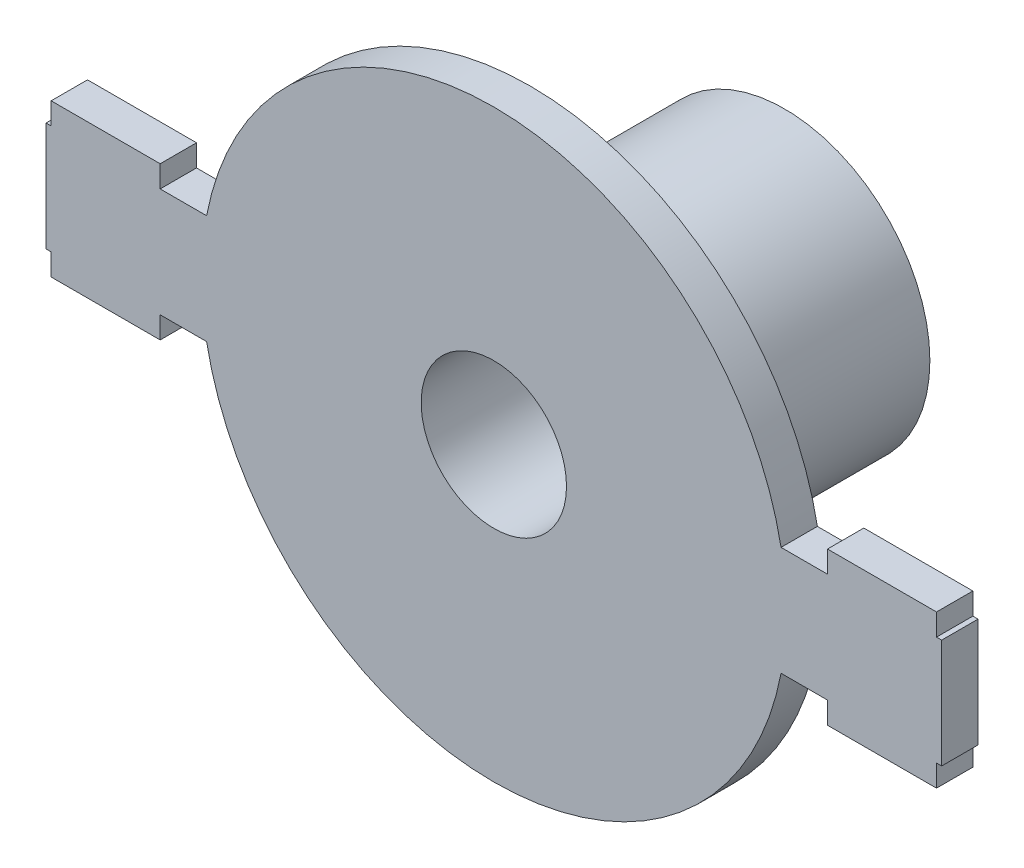
ISO-10303-21;
HEADER;
FILE_DESCRIPTION(('STEP AP214'),'2;1');
FILE_NAME('part.step','',(''),(''),'','','');
FILE_SCHEMA(('AUTOMOTIVE_DESIGN { 1 0 10303 214 1 1 1 1 }'));
ENDSEC;
DATA;
#1=APPLICATION_CONTEXT('core data for automotive mechanical design processes');
#2=APPLICATION_PROTOCOL_DEFINITION('international standard','automotive_design',2000,#1);
#3=PRODUCT_CONTEXT('',#1,'mechanical');
#4=PRODUCT('Part','Part','',(#3));
#5=PRODUCT_RELATED_PRODUCT_CATEGORY('part','',(#4));
#6=PRODUCT_DEFINITION_FORMATION('','',#4);
#7=PRODUCT_DEFINITION_CONTEXT('part definition',#1,'design');
#8=PRODUCT_DEFINITION('design','',#6,#7);
#9=PRODUCT_DEFINITION_SHAPE('','',#8);
#10=(LENGTH_UNIT() NAMED_UNIT(*) SI_UNIT(.MILLI.,.METRE.));
#11=(NAMED_UNIT(*) PLANE_ANGLE_UNIT() SI_UNIT($,.RADIAN.));
#12=(NAMED_UNIT(*) SI_UNIT($,.STERADIAN.) SOLID_ANGLE_UNIT());
#13=UNCERTAINTY_MEASURE_WITH_UNIT(LENGTH_MEASURE(1.E-05),#10,'distance_accuracy_value','');
#14=(GEOMETRIC_REPRESENTATION_CONTEXT(3) GLOBAL_UNCERTAINTY_ASSIGNED_CONTEXT((#13)) GLOBAL_UNIT_ASSIGNED_CONTEXT((#10,
#11,#12)) REPRESENTATION_CONTEXT('',''));
#15=CARTESIAN_POINT('',(0.,0.,0.));
#16=DIRECTION('',(0.,0.,1.));
#17=DIRECTION('',(1.,0.,0.));
#18=AXIS2_PLACEMENT_3D('',#15,#16,#17);
#19=CARTESIAN_POINT('',(64.,7.5,5.));
#20=DIRECTION('',(0.,-1.,0.));
#21=DIRECTION('',(0.,0.,-1.));
#22=AXIS2_PLACEMENT_3D('',#19,#20,#21);
#23=PLANE('',#22);
#24=DIRECTION('',(-1.,0.,0.));
#25=VECTOR('',#24,1.);
#26=CARTESIAN_POINT('',(64.,7.5,5.));
#27=LINE('',#26,#25);
#28=CARTESIAN_POINT('',(45.9096232902086,7.5,5.));
#29=VERTEX_POINT('',#28);
#30=CARTESIAN_POINT('',(39.5196232902086,7.5,5.));
#31=VERTEX_POINT('',#30);
#32=EDGE_CURVE('E75',#29,#31,#27,.T.);
#33=ORIENTED_EDGE('',*,*,#32,.F.);
#34=DIRECTION('',(0.,0.,-1.));
#35=VECTOR('',#34,1.);
#36=CARTESIAN_POINT('',(45.9096232902086,7.5,5.));
#37=LINE('',#36,#35);
#38=CARTESIAN_POINT('',(45.9096232902086,7.5,0.));
#39=VERTEX_POINT('',#38);
#40=EDGE_CURVE('E273',#29,#39,#37,.T.);
#41=ORIENTED_EDGE('',*,*,#40,.T.);
#42=DIRECTION('',(-1.,0.,0.));
#43=VECTOR('',#42,1.);
#44=CARTESIAN_POINT('',(64.,7.5,0.));
#45=LINE('',#44,#43);
#46=CARTESIAN_POINT('',(39.5196232902086,7.5,0.));
#47=VERTEX_POINT('',#46);
#48=EDGE_CURVE('E346',#39,#47,#45,.T.);
#49=ORIENTED_EDGE('',*,*,#48,.T.);
#50=DIRECTION('',(0.,0.,-1.));
#51=VECTOR('',#50,1.);
#52=CARTESIAN_POINT('',(39.5196232902086,7.5,5.));
#53=LINE('',#52,#51);
#54=EDGE_CURVE('E356',#47,#31,#53,.F.);
#55=ORIENTED_EDGE('',*,*,#54,.T.);
#56=EDGE_LOOP('',(#33,#41,#49,#55));
#57=FACE_BOUND('',#56,.T.);
#58=ADVANCED_FACE('F51',(#57),#23,.F.);
#59=CARTESIAN_POINT('',(64.,-7.5,5.));
#60=DIRECTION('',(0.,1.,0.));
#61=DIRECTION('',(0.,0.,1.));
#62=AXIS2_PLACEMENT_3D('',#59,#60,#61);
#63=PLANE('',#62);
#64=DIRECTION('',(-1.,0.,0.));
#65=VECTOR('',#64,1.);
#66=CARTESIAN_POINT('',(64.,-7.5,0.));
#67=LINE('',#66,#65);
#68=CARTESIAN_POINT('',(45.9096232902086,-7.5,0.));
#69=VERTEX_POINT('',#68);
#70=CARTESIAN_POINT('',(39.5196232902086,-7.5,0.));
#71=VERTEX_POINT('',#70);
#72=EDGE_CURVE('E351',#69,#71,#67,.T.);
#73=ORIENTED_EDGE('',*,*,#72,.F.);
#74=DIRECTION('',(0.,0.,1.));
#75=VECTOR('',#74,1.);
#76=CARTESIAN_POINT('',(45.9096232902086,-7.5,5.));
#77=LINE('',#76,#75);
#78=CARTESIAN_POINT('',(45.9096232902086,-7.5,5.));
#79=VERTEX_POINT('',#78);
#80=EDGE_CURVE('E60',#69,#79,#77,.T.);
#81=ORIENTED_EDGE('',*,*,#80,.T.);
#82=DIRECTION('',(-1.,0.,0.));
#83=VECTOR('',#82,1.);
#84=CARTESIAN_POINT('',(64.,-7.5,5.));
#85=LINE('',#84,#83);
#86=CARTESIAN_POINT('',(39.5196232902086,-7.5,5.));
#87=VERTEX_POINT('',#86);
#88=EDGE_CURVE('E357',#79,#87,#85,.T.);
#89=ORIENTED_EDGE('',*,*,#88,.T.);
#90=DIRECTION('',(0.,0.,-1.));
#91=VECTOR('',#90,1.);
#92=CARTESIAN_POINT('',(39.5196232902086,-7.5,5.));
#93=LINE('',#92,#91);
#94=EDGE_CURVE('E366',#87,#71,#93,.T.);
#95=ORIENTED_EDGE('',*,*,#94,.T.);
#96=EDGE_LOOP('',(#73,#81,#89,#95));
#97=FACE_BOUND('',#96,.T.);
#98=ADVANCED_FACE('F387',(#97),#63,.F.);
#99=CARTESIAN_POINT('',(-39.5196232902086,-7.5,5.));
#100=VERTEX_POINT('',#99);
#101=CARTESIAN_POINT('',(-45.9096232902086,-7.5,5.));
#102=VERTEX_POINT('',#101);
#103=EDGE_CURVE('E358',#100,#102,#85,.T.);
#104=ORIENTED_EDGE('',*,*,#103,.T.);
#105=DIRECTION('',(0.,0.,-1.));
#106=VECTOR('',#105,1.);
#107=CARTESIAN_POINT('',(-45.9096232902086,-7.5,5.));
#108=LINE('',#107,#106);
#109=CARTESIAN_POINT('',(-45.9096232902086,-7.5,0.));
#110=VERTEX_POINT('',#109);
#111=EDGE_CURVE('E324',#102,#110,#108,.T.);
#112=ORIENTED_EDGE('',*,*,#111,.T.);
#113=CARTESIAN_POINT('',(-39.5196232902086,-7.5,0.));
#114=VERTEX_POINT('',#113);
#115=EDGE_CURVE('E352',#114,#110,#67,.T.);
#116=ORIENTED_EDGE('',*,*,#115,.F.);
#117=DIRECTION('',(0.,0.,-1.));
#118=VECTOR('',#117,1.);
#119=CARTESIAN_POINT('',(-39.5196232902086,-7.5,5.));
#120=LINE('',#119,#118);
#121=EDGE_CURVE('E363',#114,#100,#120,.F.);
#122=ORIENTED_EDGE('',*,*,#121,.T.);
#123=EDGE_LOOP('',(#104,#112,#116,#122));
#124=FACE_BOUND('',#123,.T.);
#125=ADVANCED_FACE('F414',(#124),#63,.F.);
#126=CARTESIAN_POINT('',(-39.5196232902086,7.5,0.));
#127=VERTEX_POINT('',#126);
#128=CARTESIAN_POINT('',(-45.9096232902086,7.5,0.));
#129=VERTEX_POINT('',#128);
#130=EDGE_CURVE('E347',#127,#129,#45,.T.);
#131=ORIENTED_EDGE('',*,*,#130,.T.);
#132=DIRECTION('',(0.,0.,1.));
#133=VECTOR('',#132,1.);
#134=CARTESIAN_POINT('',(-45.9096232902086,7.5,5.));
#135=LINE('',#134,#133);
#136=CARTESIAN_POINT('',(-45.9096232902086,7.5,5.));
#137=VERTEX_POINT('',#136);
#138=EDGE_CURVE('E379',#129,#137,#135,.T.);
#139=ORIENTED_EDGE('',*,*,#138,.T.);
#140=CARTESIAN_POINT('',(-39.5196232902086,7.5,5.));
#141=VERTEX_POINT('',#140);
#142=EDGE_CURVE('E343',#141,#137,#27,.T.);
#143=ORIENTED_EDGE('',*,*,#142,.F.);
#144=DIRECTION('',(0.,0.,-1.));
#145=VECTOR('',#144,1.);
#146=CARTESIAN_POINT('',(-39.5196232902086,7.5,5.));
#147=LINE('',#146,#145);
#148=EDGE_CURVE('E360',#141,#127,#147,.T.);
#149=ORIENTED_EDGE('',*,*,#148,.T.);
#150=EDGE_LOOP('',(#131,#139,#143,#149));
#151=FACE_BOUND('',#150,.T.);
#152=ADVANCED_FACE('F444',(#151),#23,.F.);
#153=CARTESIAN_POINT('',(0.,0.,5.));
#154=DIRECTION('',(0.,0.,1.));
#155=DIRECTION('',(1.,0.,0.));
#156=AXIS2_PLACEMENT_3D('',#153,#154,#155);
#157=PLANE('',#156);
#158=CARTESIAN_POINT('',(0.,0.,5.));
#159=DIRECTION('',(0.,0.,1.));
#160=DIRECTION('',(1.,0.,0.));
#161=AXIS2_PLACEMENT_3D('',#158,#159,#160);
#162=CIRCLE('',#161,10.);
#163=CARTESIAN_POINT('',(10.,0.,5.));
#164=VERTEX_POINT('',#163);
#165=EDGE_CURVE('E55',#164,#164,#162,.T.);
#166=ORIENTED_EDGE('',*,*,#165,.F.);
#167=EDGE_LOOP('',(#166));
#168=FACE_BOUND('',#167,.T.);
#169=DIRECTION('',(0.,-1.,0.));
#170=VECTOR('',#169,1.);
#171=CARTESIAN_POINT('',(-60.9096232902086,10.5,5.));
#172=LINE('',#171,#170);
#173=CARTESIAN_POINT('',(-60.9096232902086,-7.5,5.));
#174=VERTEX_POINT('',#173);
#175=CARTESIAN_POINT('',(-60.9096232902086,-10.5,5.));
#176=VERTEX_POINT('',#175);
#177=EDGE_CURVE('E319',#174,#176,#172,.T.);
#178=ORIENTED_EDGE('',*,*,#177,.T.);
#179=DIRECTION('',(-1.,0.,0.));
#180=VECTOR('',#179,1.);
#181=CARTESIAN_POINT('',(-45.9096232902086,-10.5,5.));
#182=LINE('',#181,#180);
#183=CARTESIAN_POINT('',(-45.9096232902086,-10.5,5.));
#184=VERTEX_POINT('',#183);
#185=EDGE_CURVE('E289',#184,#176,#182,.T.);
#186=ORIENTED_EDGE('',*,*,#185,.F.);
#187=DIRECTION('',(0.,-1.,0.));
#188=VECTOR('',#187,1.);
#189=CARTESIAN_POINT('',(-45.9096232902086,10.5,5.));
#190=LINE('',#189,#188);
#191=EDGE_CURVE('E308',#102,#184,#190,.T.);
#192=ORIENTED_EDGE('',*,*,#191,.F.);
#193=ORIENTED_EDGE('',*,*,#103,.F.);
#194=CARTESIAN_POINT('',(0.,0.,5.));
#195=DIRECTION('',(0.,0.,1.));
#196=DIRECTION('',(1.,0.,0.));
#197=AXIS2_PLACEMENT_3D('',#194,#195,#196);
#198=CIRCLE('',#197,40.225);
#199=EDGE_CURVE('E374',#100,#87,#198,.T.);
#200=ORIENTED_EDGE('',*,*,#199,.T.);
#201=ORIENTED_EDGE('',*,*,#88,.F.);
#202=DIRECTION('',(0.,-1.,0.));
#203=VECTOR('',#202,1.);
#204=CARTESIAN_POINT('',(45.9096232902086,10.5,5.));
#205=LINE('',#204,#203);
#206=CARTESIAN_POINT('',(45.9096232902086,-10.5,5.));
#207=VERTEX_POINT('',#206);
#208=EDGE_CURVE('E263',#79,#207,#205,.T.);
#209=ORIENTED_EDGE('',*,*,#208,.T.);
#210=DIRECTION('',(-1.,0.,0.));
#211=VECTOR('',#210,1.);
#212=CARTESIAN_POINT('',(45.9096232902086,-10.5,5.));
#213=LINE('',#212,#211);
#214=CARTESIAN_POINT('',(60.9096232902086,-10.5,5.));
#215=VERTEX_POINT('',#214);
#216=EDGE_CURVE('E238',#215,#207,#213,.T.);
#217=ORIENTED_EDGE('',*,*,#216,.F.);
#218=DIRECTION('',(0.,-1.,0.));
#219=VECTOR('',#218,1.);
#220=CARTESIAN_POINT('',(60.9096232902086,10.5,5.));
#221=LINE('',#220,#219);
#222=CARTESIAN_POINT('',(60.9096232902086,-7.5,5.));
#223=VERTEX_POINT('',#222);
#224=EDGE_CURVE('E267',#223,#215,#221,.T.);
#225=ORIENTED_EDGE('',*,*,#224,.F.);
#226=CARTESIAN_POINT('',(61.6196232902086,-7.5,5.));
#227=VERTEX_POINT('',#226);
#228=EDGE_CURVE('E353',#227,#223,#85,.T.);
#229=ORIENTED_EDGE('',*,*,#228,.F.);
#230=DIRECTION('',(0.,-1.,0.));
#231=VECTOR('',#230,1.);
#232=CARTESIAN_POINT('',(61.6196232902086,7.5,5.));
#233=LINE('',#232,#231);
#234=CARTESIAN_POINT('',(61.6196232902086,7.5,5.));
#235=VERTEX_POINT('',#234);
#236=EDGE_CURVE('E281',#235,#227,#233,.T.);
#237=ORIENTED_EDGE('',*,*,#236,.F.);
#238=CARTESIAN_POINT('',(60.9096232902086,7.5,5.));
#239=VERTEX_POINT('',#238);
#240=EDGE_CURVE('E339',#235,#239,#27,.T.);
#241=ORIENTED_EDGE('',*,*,#240,.T.);
#242=CARTESIAN_POINT('',(60.9096232902086,10.5,5.));
#243=VERTEX_POINT('',#242);
#244=EDGE_CURVE('E264',#243,#239,#221,.T.);
#245=ORIENTED_EDGE('',*,*,#244,.F.);
#246=DIRECTION('',(-1.,0.,0.));
#247=VECTOR('',#246,1.);
#248=CARTESIAN_POINT('',(45.9096232902086,10.5,5.));
#249=LINE('',#248,#247);
#250=CARTESIAN_POINT('',(45.9096232902086,10.5,5.));
#251=VERTEX_POINT('',#250);
#252=EDGE_CURVE('E223',#243,#251,#249,.T.);
#253=ORIENTED_EDGE('',*,*,#252,.T.);
#254=EDGE_CURVE('E259',#251,#29,#205,.T.);
#255=ORIENTED_EDGE('',*,*,#254,.T.);
#256=ORIENTED_EDGE('',*,*,#32,.T.);
#257=EDGE_CURVE('E370',#31,#141,#198,.T.);
#258=ORIENTED_EDGE('',*,*,#257,.T.);
#259=ORIENTED_EDGE('',*,*,#142,.T.);
#260=CARTESIAN_POINT('',(-45.9096232902086,10.5,5.));
#261=VERTEX_POINT('',#260);
#262=EDGE_CURVE('E320',#261,#137,#190,.T.);
#263=ORIENTED_EDGE('',*,*,#262,.F.);
#264=DIRECTION('',(-1.,0.,0.));
#265=VECTOR('',#264,1.);
#266=CARTESIAN_POINT('',(-45.9096232902086,10.5,5.));
#267=LINE('',#266,#265);
#268=CARTESIAN_POINT('',(-60.9096232902086,10.5,5.));
#269=VERTEX_POINT('',#268);
#270=EDGE_CURVE('E300',#261,#269,#267,.T.);
#271=ORIENTED_EDGE('',*,*,#270,.T.);
#272=CARTESIAN_POINT('',(-60.9096232902086,7.5,5.));
#273=VERTEX_POINT('',#272);
#274=EDGE_CURVE('E317',#269,#273,#172,.T.);
#275=ORIENTED_EDGE('',*,*,#274,.T.);
#276=CARTESIAN_POINT('',(-61.6196232902086,7.5,5.));
#277=VERTEX_POINT('',#276);
#278=EDGE_CURVE('E336',#273,#277,#27,.T.);
#279=ORIENTED_EDGE('',*,*,#278,.T.);
#280=DIRECTION('',(0.,-1.,0.));
#281=VECTOR('',#280,1.);
#282=CARTESIAN_POINT('',(-61.6196232902086,7.5,5.));
#283=LINE('',#282,#281);
#284=CARTESIAN_POINT('',(-61.6196232902086,-7.5,5.));
#285=VERTEX_POINT('',#284);
#286=EDGE_CURVE('E330',#277,#285,#283,.T.);
#287=ORIENTED_EDGE('',*,*,#286,.T.);
#288=EDGE_CURVE('E350',#174,#285,#85,.T.);
#289=ORIENTED_EDGE('',*,*,#288,.F.);
#290=EDGE_LOOP('',(#178,#186,#192,#193,#200,#201,#209,#217,#225,#229,#237,#241,#245,#253,#255,
#256,#258,#259,#263,#271,#275,#279,#287,#289));
#291=FACE_BOUND('',#290,.T.);
#292=ADVANCED_FACE('F392',(#168,#291),#157,.T.);
#293=CARTESIAN_POINT('',(0.,0.,0.));
#294=DIRECTION('',(0.,0.,1.));
#295=DIRECTION('',(1.,0.,0.));
#296=AXIS2_PLACEMENT_3D('',#293,#294,#295);
#297=PLANE('',#296);
#298=CARTESIAN_POINT('',(0.,0.,0.));
#299=DIRECTION('',(0.,0.,1.));
#300=DIRECTION('',(1.,0.,0.));
#301=AXIS2_PLACEMENT_3D('',#298,#299,#300);
#302=CIRCLE('',#301,20.);
#303=CARTESIAN_POINT('',(20.,0.,0.));
#304=VERTEX_POINT('',#303);
#305=EDGE_CURVE('E12',#304,#304,#302,.F.);
#306=ORIENTED_EDGE('',*,*,#305,.F.);
#307=EDGE_LOOP('',(#306));
#308=FACE_BOUND('',#307,.T.);
#309=CARTESIAN_POINT('',(61.6196232902086,-7.5,0.));
#310=VERTEX_POINT('',#309);
#311=CARTESIAN_POINT('',(60.9096232902086,-7.5,0.));
#312=VERTEX_POINT('',#311);
#313=EDGE_CURVE('E348',#310,#312,#67,.T.);
#314=ORIENTED_EDGE('',*,*,#313,.T.);
#315=DIRECTION('',(0.,-1.,0.));
#316=VECTOR('',#315,1.);
#317=CARTESIAN_POINT('',(60.9096232902086,10.5,0.));
#318=LINE('',#317,#316);
#319=CARTESIAN_POINT('',(60.9096232902086,-10.5,0.));
#320=VERTEX_POINT('',#319);
#321=EDGE_CURVE('E229',#312,#320,#318,.T.);
#322=ORIENTED_EDGE('',*,*,#321,.T.);
#323=DIRECTION('',(1.,0.,0.));
#324=VECTOR('',#323,1.);
#325=CARTESIAN_POINT('',(45.9096232902086,-10.5,0.));
#326=LINE('',#325,#324);
#327=CARTESIAN_POINT('',(45.9096232902086,-10.5,0.));
#328=VERTEX_POINT('',#327);
#329=EDGE_CURVE('E226',#328,#320,#326,.T.);
#330=ORIENTED_EDGE('',*,*,#329,.F.);
#331=DIRECTION('',(0.,-1.,0.));
#332=VECTOR('',#331,1.);
#333=CARTESIAN_POINT('',(45.9096232902086,10.5,0.));
#334=LINE('',#333,#332);
#335=EDGE_CURVE('E214',#69,#328,#334,.T.);
#336=ORIENTED_EDGE('',*,*,#335,.F.);
#337=ORIENTED_EDGE('',*,*,#72,.T.);
#338=CARTESIAN_POINT('',(0.,0.,0.));
#339=DIRECTION('',(0.,0.,1.));
#340=DIRECTION('',(1.,0.,0.));
#341=AXIS2_PLACEMENT_3D('',#338,#339,#340);
#342=CIRCLE('',#341,40.225);
#343=EDGE_CURVE('E369',#114,#71,#342,.T.);
#344=ORIENTED_EDGE('',*,*,#343,.F.);
#345=ORIENTED_EDGE('',*,*,#115,.T.);
#346=DIRECTION('',(0.,-1.,0.));
#347=VECTOR('',#346,1.);
#348=CARTESIAN_POINT('',(-45.9096232902086,10.5,0.));
#349=LINE('',#348,#347);
#350=CARTESIAN_POINT('',(-45.9096232902086,-10.5,0.));
#351=VERTEX_POINT('',#350);
#352=EDGE_CURVE('E313',#110,#351,#349,.T.);
#353=ORIENTED_EDGE('',*,*,#352,.T.);
#354=DIRECTION('',(1.,0.,0.));
#355=VECTOR('',#354,1.);
#356=CARTESIAN_POINT('',(-45.9096232902086,-10.5,0.));
#357=LINE('',#356,#355);
#358=CARTESIAN_POINT('',(-60.9096232902086,-10.5,0.));
#359=VERTEX_POINT('',#358);
#360=EDGE_CURVE('E294',#359,#351,#357,.T.);
#361=ORIENTED_EDGE('',*,*,#360,.F.);
#362=DIRECTION('',(0.,-1.,0.));
#363=VECTOR('',#362,1.);
#364=CARTESIAN_POINT('',(-60.9096232902086,10.5,0.));
#365=LINE('',#364,#363);
#366=CARTESIAN_POINT('',(-60.9096232902086,-7.5,0.));
#367=VERTEX_POINT('',#366);
#368=EDGE_CURVE('E316',#367,#359,#365,.T.);
#369=ORIENTED_EDGE('',*,*,#368,.F.);
#370=CARTESIAN_POINT('',(-61.6196232902086,-7.5,0.));
#371=VERTEX_POINT('',#370);
#372=EDGE_CURVE('E345',#367,#371,#67,.T.);
#373=ORIENTED_EDGE('',*,*,#372,.T.);
#374=DIRECTION('',(0.,-1.,0.));
#375=VECTOR('',#374,1.);
#376=CARTESIAN_POINT('',(-61.6196232902086,7.5,0.));
#377=LINE('',#376,#375);
#378=CARTESIAN_POINT('',(-61.6196232902086,7.5,0.));
#379=VERTEX_POINT('',#378);
#380=EDGE_CURVE('E333',#379,#371,#377,.T.);
#381=ORIENTED_EDGE('',*,*,#380,.F.);
#382=CARTESIAN_POINT('',(-60.9096232902086,7.5,0.));
#383=VERTEX_POINT('',#382);
#384=EDGE_CURVE('E342',#383,#379,#45,.T.);
#385=ORIENTED_EDGE('',*,*,#384,.F.);
#386=CARTESIAN_POINT('',(-60.9096232902086,10.5,0.));
#387=VERTEX_POINT('',#386);
#388=EDGE_CURVE('E314',#387,#383,#365,.T.);
#389=ORIENTED_EDGE('',*,*,#388,.F.);
#390=DIRECTION('',(1.,0.,0.));
#391=VECTOR('',#390,1.);
#392=CARTESIAN_POINT('',(-45.9096232902086,10.5,0.));
#393=LINE('',#392,#391);
#394=CARTESIAN_POINT('',(-45.9096232902086,10.5,0.));
#395=VERTEX_POINT('',#394);
#396=EDGE_CURVE('E305',#387,#395,#393,.T.);
#397=ORIENTED_EDGE('',*,*,#396,.T.);
#398=EDGE_CURVE('E309',#395,#129,#349,.T.);
#399=ORIENTED_EDGE('',*,*,#398,.T.);
#400=ORIENTED_EDGE('',*,*,#130,.F.);
#401=EDGE_CURVE('E375',#47,#127,#342,.T.);
#402=ORIENTED_EDGE('',*,*,#401,.F.);
#403=ORIENTED_EDGE('',*,*,#48,.F.);
#404=CARTESIAN_POINT('',(45.9096232902086,10.5,0.));
#405=VERTEX_POINT('',#404);
#406=EDGE_CURVE('E222',#405,#39,#334,.T.);
#407=ORIENTED_EDGE('',*,*,#406,.F.);
#408=DIRECTION('',(1.,0.,0.));
#409=VECTOR('',#408,1.);
#410=CARTESIAN_POINT('',(45.9096232902086,10.5,0.));
#411=LINE('',#410,#409);
#412=CARTESIAN_POINT('',(60.9096232902086,10.5,0.));
#413=VERTEX_POINT('',#412);
#414=EDGE_CURVE('E251',#405,#413,#411,.T.);
#415=ORIENTED_EDGE('',*,*,#414,.T.);
#416=CARTESIAN_POINT('',(60.9096232902086,7.5,0.));
#417=VERTEX_POINT('',#416);
#418=EDGE_CURVE('E268',#413,#417,#318,.T.);
#419=ORIENTED_EDGE('',*,*,#418,.T.);
#420=CARTESIAN_POINT('',(61.6196232902086,7.5,0.));
#421=VERTEX_POINT('',#420);
#422=EDGE_CURVE('E67',#421,#417,#45,.T.);
#423=ORIENTED_EDGE('',*,*,#422,.F.);
#424=DIRECTION('',(0.,-1.,0.));
#425=VECTOR('',#424,1.);
#426=CARTESIAN_POINT('',(61.6196232902086,7.5,0.));
#427=LINE('',#426,#425);
#428=EDGE_CURVE('E278',#421,#310,#427,.T.);
#429=ORIENTED_EDGE('',*,*,#428,.T.);
#430=EDGE_LOOP('',(#314,#322,#330,#336,#337,#344,#345,#353,#361,#369,#373,#381,#385,#389,#397,
#399,#400,#402,#403,#407,#415,#419,#423,#429));
#431=FACE_BOUND('',#430,.T.);
#432=ADVANCED_FACE('F228',(#308,#431),#297,.F.);
#433=ORIENTED_EDGE('',*,*,#372,.F.);
#434=DIRECTION('',(0.,0.,1.));
#435=VECTOR('',#434,1.);
#436=CARTESIAN_POINT('',(-60.9096232902086,-7.5,5.));
#437=LINE('',#436,#435);
#438=EDGE_CURVE('E312',#367,#174,#437,.T.);
#439=ORIENTED_EDGE('',*,*,#438,.T.);
#440=ORIENTED_EDGE('',*,*,#288,.T.);
#441=DIRECTION('',(0.,0.,-1.));
#442=VECTOR('',#441,1.);
#443=CARTESIAN_POINT('',(-61.6196232902086,-7.5,0.));
#444=LINE('',#443,#442);
#445=EDGE_CURVE('E326',#285,#371,#444,.T.);
#446=ORIENTED_EDGE('',*,*,#445,.T.);
#447=EDGE_LOOP('',(#433,#439,#440,#446));
#448=FACE_BOUND('',#447,.T.);
#449=ADVANCED_FACE('F395',(#448),#63,.F.);
#450=ORIENTED_EDGE('',*,*,#278,.F.);
#451=DIRECTION('',(0.,0.,-1.));
#452=VECTOR('',#451,1.);
#453=CARTESIAN_POINT('',(-60.9096232902086,7.5,5.));
#454=LINE('',#453,#452);
#455=EDGE_CURVE('E373',#273,#383,#454,.T.);
#456=ORIENTED_EDGE('',*,*,#455,.T.);
#457=ORIENTED_EDGE('',*,*,#384,.T.);
#458=DIRECTION('',(0.,0.,-1.));
#459=VECTOR('',#458,1.);
#460=CARTESIAN_POINT('',(-61.6196232902086,7.5,0.));
#461=LINE('',#460,#459);
#462=EDGE_CURVE('E327',#277,#379,#461,.T.);
#463=ORIENTED_EDGE('',*,*,#462,.F.);
#464=EDGE_LOOP('',(#450,#456,#457,#463));
#465=FACE_BOUND('',#464,.T.);
#466=ADVANCED_FACE('F445',(#465),#23,.F.);
#467=CARTESIAN_POINT('',(0.,0.,5.));
#468=DIRECTION('',(0.,0.,-1.));
#469=DIRECTION('',(-1.,0.,0.));
#470=AXIS2_PLACEMENT_3D('',#467,#468,#469);
#471=CYLINDRICAL_SURFACE('',#470,40.225);
#472=ORIENTED_EDGE('',*,*,#94,.F.);
#473=ORIENTED_EDGE('',*,*,#199,.F.);
#474=ORIENTED_EDGE('',*,*,#121,.F.);
#475=ORIENTED_EDGE('',*,*,#343,.T.);
#476=EDGE_LOOP('',(#472,#473,#474,#475));
#477=FACE_BOUND('',#476,.T.);
#478=ADVANCED_FACE('F53',(#477),#471,.T.);
#479=ORIENTED_EDGE('',*,*,#148,.F.);
#480=ORIENTED_EDGE('',*,*,#257,.F.);
#481=ORIENTED_EDGE('',*,*,#54,.F.);
#482=ORIENTED_EDGE('',*,*,#401,.T.);
#483=EDGE_LOOP('',(#479,#480,#481,#482));
#484=FACE_BOUND('',#483,.T.);
#485=ADVANCED_FACE('F461',(#484),#471,.T.);
#486=ORIENTED_EDGE('',*,*,#422,.T.);
#487=DIRECTION('',(0.,0.,1.));
#488=VECTOR('',#487,1.);
#489=CARTESIAN_POINT('',(60.9096232902086,7.5,5.));
#490=LINE('',#489,#488);
#491=EDGE_CURVE('E262',#417,#239,#490,.T.);
#492=ORIENTED_EDGE('',*,*,#491,.T.);
#493=ORIENTED_EDGE('',*,*,#240,.F.);
#494=DIRECTION('',(0.,0.,-1.));
#495=VECTOR('',#494,1.);
#496=CARTESIAN_POINT('',(61.6196232902086,7.5,5.));
#497=LINE('',#496,#495);
#498=EDGE_CURVE('E276',#235,#421,#497,.T.);
#499=ORIENTED_EDGE('',*,*,#498,.T.);
#500=EDGE_LOOP('',(#486,#492,#493,#499));
#501=FACE_BOUND('',#500,.T.);
#502=ADVANCED_FACE('F454',(#501),#23,.F.);
#503=ORIENTED_EDGE('',*,*,#228,.T.);
#504=DIRECTION('',(0.,0.,-1.));
#505=VECTOR('',#504,1.);
#506=CARTESIAN_POINT('',(60.9096232902086,-7.5,5.));
#507=LINE('',#506,#505);
#508=EDGE_CURVE('E382',#223,#312,#507,.T.);
#509=ORIENTED_EDGE('',*,*,#508,.T.);
#510=ORIENTED_EDGE('',*,*,#313,.F.);
#511=DIRECTION('',(0.,0.,-1.));
#512=VECTOR('',#511,1.);
#513=CARTESIAN_POINT('',(61.6196232902086,-7.5,5.));
#514=LINE('',#513,#512);
#515=EDGE_CURVE('E275',#227,#310,#514,.T.);
#516=ORIENTED_EDGE('',*,*,#515,.F.);
#517=EDGE_LOOP('',(#503,#509,#510,#516));
#518=FACE_BOUND('',#517,.T.);
#519=ADVANCED_FACE('F450',(#518),#63,.F.);
#520=CARTESIAN_POINT('',(-61.6196232902086,7.5,0.));
#521=DIRECTION('',(-1.,0.,0.));
#522=DIRECTION('',(0.,0.,1.));
#523=AXIS2_PLACEMENT_3D('',#520,#521,#522);
#524=PLANE('',#523);
#525=ORIENTED_EDGE('',*,*,#445,.F.);
#526=ORIENTED_EDGE('',*,*,#286,.F.);
#527=ORIENTED_EDGE('',*,*,#462,.T.);
#528=ORIENTED_EDGE('',*,*,#380,.T.);
#529=EDGE_LOOP('',(#525,#526,#527,#528));
#530=FACE_BOUND('',#529,.T.);
#531=ADVANCED_FACE('F403',(#530),#524,.T.);
#532=CARTESIAN_POINT('',(0.,10.5,0.));
#533=DIRECTION('',(0.,1.,0.));
#534=DIRECTION('',(0.,0.,1.));
#535=AXIS2_PLACEMENT_3D('',#532,#533,#534);
#536=PLANE('',#535);
#537=DIRECTION('',(0.,0.,1.));
#538=VECTOR('',#537,1.);
#539=CARTESIAN_POINT('',(-45.9096232902086,10.5,5.));
#540=LINE('',#539,#538);
#541=EDGE_CURVE('E297',#395,#261,#540,.T.);
#542=ORIENTED_EDGE('',*,*,#541,.F.);
#543=ORIENTED_EDGE('',*,*,#396,.F.);
#544=DIRECTION('',(0.,0.,-1.));
#545=VECTOR('',#544,1.);
#546=CARTESIAN_POINT('',(-60.9096232902086,10.5,5.));
#547=LINE('',#546,#545);
#548=EDGE_CURVE('E302',#269,#387,#547,.T.);
#549=ORIENTED_EDGE('',*,*,#548,.F.);
#550=ORIENTED_EDGE('',*,*,#270,.F.);
#551=EDGE_LOOP('',(#542,#543,#549,#550));
#552=FACE_BOUND('',#551,.T.);
#553=ADVANCED_FACE('F440',(#552),#536,.T.);
#554=CARTESIAN_POINT('',(-60.9096232902086,10.5,5.));
#555=DIRECTION('',(-1.,0.,0.));
#556=DIRECTION('',(0.,0.,1.));
#557=AXIS2_PLACEMENT_3D('',#554,#555,#556);
#558=PLANE('',#557);
#559=ORIENTED_EDGE('',*,*,#455,.F.);
#560=ORIENTED_EDGE('',*,*,#274,.F.);
#561=ORIENTED_EDGE('',*,*,#548,.T.);
#562=ORIENTED_EDGE('',*,*,#388,.T.);
#563=EDGE_LOOP('',(#559,#560,#561,#562));
#564=FACE_BOUND('',#563,.T.);
#565=ADVANCED_FACE('F429',(#564),#558,.T.);
#566=CARTESIAN_POINT('',(-45.9096232902086,10.5,5.));
#567=DIRECTION('',(1.,0.,0.));
#568=DIRECTION('',(0.,0.,-1.));
#569=AXIS2_PLACEMENT_3D('',#566,#567,#568);
#570=PLANE('',#569);
#571=ORIENTED_EDGE('',*,*,#138,.F.);
#572=ORIENTED_EDGE('',*,*,#398,.F.);
#573=ORIENTED_EDGE('',*,*,#541,.T.);
#574=ORIENTED_EDGE('',*,*,#262,.T.);
#575=EDGE_LOOP('',(#571,#572,#573,#574));
#576=FACE_BOUND('',#575,.T.);
#577=ADVANCED_FACE('F436',(#576),#570,.T.);
#578=ORIENTED_EDGE('',*,*,#111,.F.);
#579=ORIENTED_EDGE('',*,*,#191,.T.);
#580=DIRECTION('',(0.,0.,1.));
#581=VECTOR('',#580,1.);
#582=CARTESIAN_POINT('',(-45.9096232902086,-10.5,5.));
#583=LINE('',#582,#581);
#584=EDGE_CURVE('E284',#351,#184,#583,.T.);
#585=ORIENTED_EDGE('',*,*,#584,.F.);
#586=ORIENTED_EDGE('',*,*,#352,.F.);
#587=EDGE_LOOP('',(#578,#579,#585,#586));
#588=FACE_BOUND('',#587,.T.);
#589=ADVANCED_FACE('F420',(#588),#570,.T.);
#590=ORIENTED_EDGE('',*,*,#438,.F.);
#591=ORIENTED_EDGE('',*,*,#368,.T.);
#592=DIRECTION('',(0.,0.,-1.));
#593=VECTOR('',#592,1.);
#594=CARTESIAN_POINT('',(-60.9096232902086,-10.5,5.));
#595=LINE('',#594,#593);
#596=EDGE_CURVE('E291',#176,#359,#595,.T.);
#597=ORIENTED_EDGE('',*,*,#596,.F.);
#598=ORIENTED_EDGE('',*,*,#177,.F.);
#599=EDGE_LOOP('',(#590,#591,#597,#598));
#600=FACE_BOUND('',#599,.T.);
#601=ADVANCED_FACE('F426',(#600),#558,.T.);
#602=CARTESIAN_POINT('',(0.,-10.5,0.));
#603=DIRECTION('',(0.,1.,0.));
#604=DIRECTION('',(0.,0.,1.));
#605=AXIS2_PLACEMENT_3D('',#602,#603,#604);
#606=PLANE('',#605);
#607=ORIENTED_EDGE('',*,*,#584,.T.);
#608=ORIENTED_EDGE('',*,*,#185,.T.);
#609=ORIENTED_EDGE('',*,*,#596,.T.);
#610=ORIENTED_EDGE('',*,*,#360,.T.);
#611=EDGE_LOOP('',(#607,#608,#609,#610));
#612=FACE_BOUND('',#611,.T.);
#613=ADVANCED_FACE('F423',(#612),#606,.F.);
#614=CARTESIAN_POINT('',(61.6196232902086,7.5,5.));
#615=DIRECTION('',(-1.,0.,0.));
#616=DIRECTION('',(0.,0.,1.));
#617=AXIS2_PLACEMENT_3D('',#614,#615,#616);
#618=PLANE('',#617);
#619=ORIENTED_EDGE('',*,*,#515,.T.);
#620=ORIENTED_EDGE('',*,*,#428,.F.);
#621=ORIENTED_EDGE('',*,*,#498,.F.);
#622=ORIENTED_EDGE('',*,*,#236,.T.);
#623=EDGE_LOOP('',(#619,#620,#621,#622));
#624=FACE_BOUND('',#623,.T.);
#625=ADVANCED_FACE('F434',(#624),#618,.F.);
#626=CARTESIAN_POINT('',(0.,-10.5,0.));
#627=DIRECTION('',(0.,-1.,0.));
#628=DIRECTION('',(0.,0.,-1.));
#629=AXIS2_PLACEMENT_3D('',#626,#627,#628);
#630=PLANE('',#629);
#631=DIRECTION('',(0.,0.,-1.));
#632=VECTOR('',#631,1.);
#633=CARTESIAN_POINT('',(45.9096232902086,-10.5,5.));
#634=LINE('',#633,#632);
#635=EDGE_CURVE('E218',#207,#328,#634,.T.);
#636=ORIENTED_EDGE('',*,*,#635,.T.);
#637=ORIENTED_EDGE('',*,*,#329,.T.);
#638=DIRECTION('',(0.,0.,1.));
#639=VECTOR('',#638,1.);
#640=CARTESIAN_POINT('',(60.9096232902086,-10.5,5.));
#641=LINE('',#640,#639);
#642=EDGE_CURVE('E233',#320,#215,#641,.T.);
#643=ORIENTED_EDGE('',*,*,#642,.T.);
#644=ORIENTED_EDGE('',*,*,#216,.T.);
#645=EDGE_LOOP('',(#636,#637,#643,#644));
#646=FACE_BOUND('',#645,.T.);
#647=ADVANCED_FACE('F236',(#646),#630,.T.);
#648=CARTESIAN_POINT('',(60.9096232902086,10.5,5.));
#649=DIRECTION('',(1.,0.,0.));
#650=DIRECTION('',(0.,0.,-1.));
#651=AXIS2_PLACEMENT_3D('',#648,#649,#650);
#652=PLANE('',#651);
#653=ORIENTED_EDGE('',*,*,#508,.F.);
#654=ORIENTED_EDGE('',*,*,#224,.T.);
#655=ORIENTED_EDGE('',*,*,#642,.F.);
#656=ORIENTED_EDGE('',*,*,#321,.F.);
#657=EDGE_LOOP('',(#653,#654,#655,#656));
#658=FACE_BOUND('',#657,.T.);
#659=ADVANCED_FACE('F503',(#658),#652,.T.);
#660=CARTESIAN_POINT('',(45.9096232902086,10.5,5.));
#661=DIRECTION('',(-1.,0.,0.));
#662=DIRECTION('',(0.,0.,1.));
#663=AXIS2_PLACEMENT_3D('',#660,#661,#662);
#664=PLANE('',#663);
#665=ORIENTED_EDGE('',*,*,#80,.F.);
#666=ORIENTED_EDGE('',*,*,#335,.T.);
#667=ORIENTED_EDGE('',*,*,#635,.F.);
#668=ORIENTED_EDGE('',*,*,#208,.F.);
#669=EDGE_LOOP('',(#665,#666,#667,#668));
#670=FACE_BOUND('',#669,.T.);
#671=ADVANCED_FACE('F216',(#670),#664,.T.);
#672=ORIENTED_EDGE('',*,*,#40,.F.);
#673=ORIENTED_EDGE('',*,*,#254,.F.);
#674=DIRECTION('',(0.,0.,-1.));
#675=VECTOR('',#674,1.);
#676=CARTESIAN_POINT('',(45.9096232902086,10.5,5.));
#677=LINE('',#676,#675);
#678=EDGE_CURVE('E248',#251,#405,#677,.T.);
#679=ORIENTED_EDGE('',*,*,#678,.T.);
#680=ORIENTED_EDGE('',*,*,#406,.T.);
#681=EDGE_LOOP('',(#672,#673,#679,#680));
#682=FACE_BOUND('',#681,.T.);
#683=ADVANCED_FACE('F493',(#682),#664,.T.);
#684=ORIENTED_EDGE('',*,*,#491,.F.);
#685=ORIENTED_EDGE('',*,*,#418,.F.);
#686=DIRECTION('',(0.,0.,1.));
#687=VECTOR('',#686,1.);
#688=CARTESIAN_POINT('',(60.9096232902086,10.5,5.));
#689=LINE('',#688,#687);
#690=EDGE_CURVE('E254',#413,#243,#689,.T.);
#691=ORIENTED_EDGE('',*,*,#690,.T.);
#692=ORIENTED_EDGE('',*,*,#244,.T.);
#693=EDGE_LOOP('',(#684,#685,#691,#692));
#694=FACE_BOUND('',#693,.T.);
#695=ADVANCED_FACE('F496',(#694),#652,.T.);
#696=CARTESIAN_POINT('',(0.,10.5,0.));
#697=DIRECTION('',(0.,-1.,0.));
#698=DIRECTION('',(0.,0.,-1.));
#699=AXIS2_PLACEMENT_3D('',#696,#697,#698);
#700=PLANE('',#699);
#701=ORIENTED_EDGE('',*,*,#678,.F.);
#702=ORIENTED_EDGE('',*,*,#252,.F.);
#703=ORIENTED_EDGE('',*,*,#690,.F.);
#704=ORIENTED_EDGE('',*,*,#414,.F.);
#705=EDGE_LOOP('',(#701,#702,#703,#704));
#706=FACE_BOUND('',#705,.T.);
#707=ADVANCED_FACE('F491',(#706),#700,.F.);
#708=CARTESIAN_POINT('',(0.,0.,-35.));
#709=DIRECTION('',(0.,0.,-1.));
#710=DIRECTION('',(-1.,0.,0.));
#711=AXIS2_PLACEMENT_3D('',#708,#709,#710);
#712=PLANE('',#711);
#713=CARTESIAN_POINT('',(0.,0.,-35.));
#714=DIRECTION('',(0.,0.,-1.));
#715=DIRECTION('',(-1.,0.,0.));
#716=AXIS2_PLACEMENT_3D('',#713,#714,#715);
#717=CIRCLE('',#716,20.);
#718=CARTESIAN_POINT('',(-20.,0.,-35.));
#719=VERTEX_POINT('',#718);
#720=EDGE_CURVE('E239',#719,#719,#717,.T.);
#721=ORIENTED_EDGE('',*,*,#720,.T.);
#722=EDGE_LOOP('',(#721));
#723=FACE_BOUND('',#722,.T.);
#724=CARTESIAN_POINT('',(0.,0.,-35.));
#725=DIRECTION('',(0.,0.,-1.));
#726=DIRECTION('',(-1.,0.,0.));
#727=AXIS2_PLACEMENT_3D('',#724,#725,#726);
#728=CIRCLE('',#727,10.);
#729=CARTESIAN_POINT('',(-10.,0.,-35.));
#730=VERTEX_POINT('',#729);
#731=EDGE_CURVE('E242',#730,#730,#728,.T.);
#732=ORIENTED_EDGE('',*,*,#731,.F.);
#733=EDGE_LOOP('',(#732));
#734=FACE_BOUND('',#733,.T.);
#735=ADVANCED_FACE('F518',(#723,#734),#712,.T.);
#736=CARTESIAN_POINT('',(0.,0.,-35.));
#737=DIRECTION('',(0.,0.,1.));
#738=DIRECTION('',(1.,0.,0.));
#739=AXIS2_PLACEMENT_3D('',#736,#737,#738);
#740=CYLINDRICAL_SURFACE('',#739,20.);
#741=ORIENTED_EDGE('',*,*,#720,.F.);
#742=EDGE_LOOP('',(#741));
#743=FACE_BOUND('',#742,.T.);
#744=ORIENTED_EDGE('',*,*,#305,.T.);
#745=EDGE_LOOP('',(#744));
#746=FACE_BOUND('',#745,.T.);
#747=ADVANCED_FACE('F600',(#743,#746),#740,.T.);
#748=CARTESIAN_POINT('',(0.,0.,-35.));
#749=DIRECTION('',(0.,0.,1.));
#750=DIRECTION('',(1.,0.,0.));
#751=AXIS2_PLACEMENT_3D('',#748,#749,#750);
#752=CYLINDRICAL_SURFACE('',#751,10.);
#753=ORIENTED_EDGE('',*,*,#731,.T.);
#754=EDGE_LOOP('',(#753));
#755=FACE_BOUND('',#754,.T.);
#756=ORIENTED_EDGE('',*,*,#165,.T.);
#757=EDGE_LOOP('',(#756));
#758=FACE_BOUND('',#757,.T.);
#759=ADVANCED_FACE('F610',(#755,#758),#752,.F.);
#760=CLOSED_SHELL('',(#58,#98,#125,#152,#292,#432,#449,#466,#478,#485,#502,#519,#531,#553,#565,
#577,#589,#601,#613,#625,#647,#659,#671,#683,#695,#707,#735,#747,#759));
#761=MANIFOLD_SOLID_BREP('B2',#760);
#762=ADVANCED_BREP_SHAPE_REPRESENTATION('',(#18,#761),#14);
#763=SHAPE_DEFINITION_REPRESENTATION(#9,#762);
ENDSEC;
END-ISO-10303-21;
